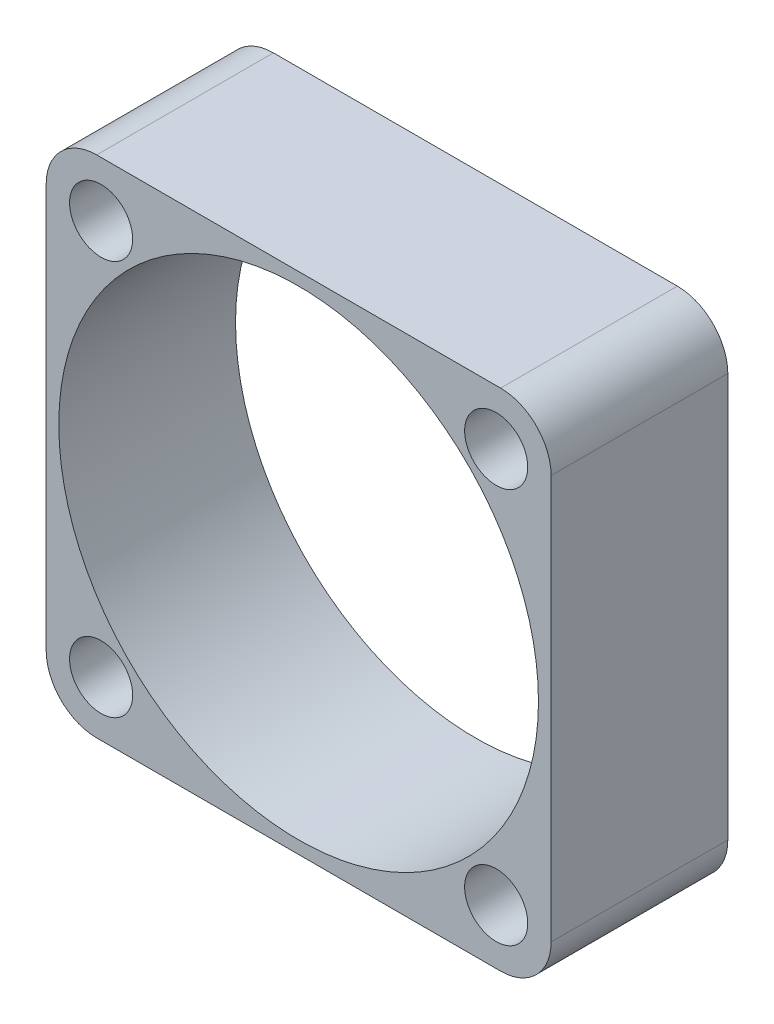
ISO-10303-21;
HEADER;
FILE_DESCRIPTION(('STEP AP214'),'2;1');
FILE_NAME('part.step','',(''),(''),'','','');
FILE_SCHEMA(('AUTOMOTIVE_DESIGN { 1 0 10303 214 1 1 1 1 }'));
ENDSEC;
DATA;
#1=APPLICATION_CONTEXT('core data for automotive mechanical design processes');
#2=APPLICATION_PROTOCOL_DEFINITION('international standard','automotive_design',2000,#1);
#3=PRODUCT_CONTEXT('',#1,'mechanical');
#4=PRODUCT('Part','Part','',(#3));
#5=PRODUCT_RELATED_PRODUCT_CATEGORY('part','',(#4));
#6=PRODUCT_DEFINITION_FORMATION('','',#4);
#7=PRODUCT_DEFINITION_CONTEXT('part definition',#1,'design');
#8=PRODUCT_DEFINITION('design','',#6,#7);
#9=PRODUCT_DEFINITION_SHAPE('','',#8);
#10=(LENGTH_UNIT() NAMED_UNIT(*) SI_UNIT(.MILLI.,.METRE.));
#11=(NAMED_UNIT(*) PLANE_ANGLE_UNIT() SI_UNIT($,.RADIAN.));
#12=(NAMED_UNIT(*) SI_UNIT($,.STERADIAN.) SOLID_ANGLE_UNIT());
#13=UNCERTAINTY_MEASURE_WITH_UNIT(LENGTH_MEASURE(1.E-05),#10,'distance_accuracy_value','');
#14=(GEOMETRIC_REPRESENTATION_CONTEXT(3) GLOBAL_UNCERTAINTY_ASSIGNED_CONTEXT((#13)) GLOBAL_UNIT_ASSIGNED_CONTEXT((#10,
#11,#12)) REPRESENTATION_CONTEXT('',''));
#15=CARTESIAN_POINT('',(0.,0.,0.));
#16=DIRECTION('',(0.,0.,1.));
#17=DIRECTION('',(1.,0.,0.));
#18=AXIS2_PLACEMENT_3D('',#15,#16,#17);
#19=CARTESIAN_POINT('',(0.,0.,7.));
#20=DIRECTION('',(0.,0.,-1.));
#21=DIRECTION('',(-1.,0.,0.));
#22=AXIS2_PLACEMENT_3D('',#19,#20,#21);
#23=PLANE('',#22);
#24=CARTESIAN_POINT('',(-7.825,-7.825,7.));
#25=DIRECTION('',(0.,0.,1.));
#26=DIRECTION('',(1.,0.,0.));
#27=AXIS2_PLACEMENT_3D('',#24,#25,#26);
#28=CIRCLE('',#27,1.25);
#29=CARTESIAN_POINT('',(-6.575,-7.825,7.));
#30=VERTEX_POINT('',#29);
#31=EDGE_CURVE('E213',#30,#30,#28,.T.);
#32=ORIENTED_EDGE('',*,*,#31,.F.);
#33=EDGE_LOOP('',(#32));
#34=FACE_BOUND('',#33,.T.);
#35=CARTESIAN_POINT('',(7.825,-7.825,7.));
#36=DIRECTION('',(0.,0.,1.));
#37=DIRECTION('',(1.,0.,0.));
#38=AXIS2_PLACEMENT_3D('',#35,#36,#37);
#39=CIRCLE('',#38,1.25);
#40=CARTESIAN_POINT('',(9.075,-7.825,7.));
#41=VERTEX_POINT('',#40);
#42=EDGE_CURVE('E207',#41,#41,#39,.T.);
#43=ORIENTED_EDGE('',*,*,#42,.F.);
#44=EDGE_LOOP('',(#43));
#45=FACE_BOUND('',#44,.T.);
#46=CARTESIAN_POINT('',(7.825,7.825,7.));
#47=DIRECTION('',(0.,0.,1.));
#48=DIRECTION('',(1.,0.,0.));
#49=AXIS2_PLACEMENT_3D('',#46,#47,#48);
#50=CIRCLE('',#49,1.25);
#51=CARTESIAN_POINT('',(9.075,7.825,7.));
#52=VERTEX_POINT('',#51);
#53=EDGE_CURVE('E201',#52,#52,#50,.T.);
#54=ORIENTED_EDGE('',*,*,#53,.F.);
#55=EDGE_LOOP('',(#54));
#56=FACE_BOUND('',#55,.T.);
#57=CARTESIAN_POINT('',(-7.825,7.825,7.));
#58=DIRECTION('',(0.,0.,1.));
#59=DIRECTION('',(1.,0.,0.));
#60=AXIS2_PLACEMENT_3D('',#57,#58,#59);
#61=CIRCLE('',#60,1.25);
#62=CARTESIAN_POINT('',(-6.575,7.825,7.));
#63=VERTEX_POINT('',#62);
#64=EDGE_CURVE('E195',#63,#63,#61,.T.);
#65=ORIENTED_EDGE('',*,*,#64,.F.);
#66=EDGE_LOOP('',(#65));
#67=FACE_BOUND('',#66,.T.);
#68=DIRECTION('',(-1.,0.,0.));
#69=VECTOR('',#68,1.);
#70=CARTESIAN_POINT('',(-10.,10.,7.));
#71=LINE('',#70,#69);
#72=CARTESIAN_POINT('',(8.,10.,7.));
#73=VERTEX_POINT('',#72);
#74=CARTESIAN_POINT('',(-8.,10.,7.));
#75=VERTEX_POINT('',#74);
#76=EDGE_CURVE('E179',#73,#75,#71,.T.);
#77=ORIENTED_EDGE('',*,*,#76,.T.);
#78=CARTESIAN_POINT('',(-8.,8.,7.));
#79=DIRECTION('',(0.,0.,-1.));
#80=DIRECTION('',(-1.,0.,0.));
#81=AXIS2_PLACEMENT_3D('',#78,#79,#80);
#82=CIRCLE('',#81,2.);
#83=CARTESIAN_POINT('',(-10.,8.,7.));
#84=VERTEX_POINT('',#83);
#85=EDGE_CURVE('E160',#75,#84,#82,.F.);
#86=ORIENTED_EDGE('',*,*,#85,.T.);
#87=DIRECTION('',(0.,-1.,0.));
#88=VECTOR('',#87,1.);
#89=CARTESIAN_POINT('',(-10.,-10.,7.));
#90=LINE('',#89,#88);
#91=CARTESIAN_POINT('',(-10.,-8.,7.));
#92=VERTEX_POINT('',#91);
#93=EDGE_CURVE('E130',#84,#92,#90,.T.);
#94=ORIENTED_EDGE('',*,*,#93,.T.);
#95=CARTESIAN_POINT('',(-8.,-8.,7.));
#96=DIRECTION('',(0.,0.,-1.));
#97=DIRECTION('',(-1.,0.,0.));
#98=AXIS2_PLACEMENT_3D('',#95,#96,#97);
#99=CIRCLE('',#98,2.);
#100=CARTESIAN_POINT('',(-8.,-10.,7.));
#101=VERTEX_POINT('',#100);
#102=EDGE_CURVE('E66',#92,#101,#99,.F.);
#103=ORIENTED_EDGE('',*,*,#102,.T.);
#104=DIRECTION('',(1.,0.,0.));
#105=VECTOR('',#104,1.);
#106=CARTESIAN_POINT('',(-10.,-10.,7.));
#107=LINE('',#106,#105);
#108=CARTESIAN_POINT('',(8.,-10.,7.));
#109=VERTEX_POINT('',#108);
#110=EDGE_CURVE('E146',#101,#109,#107,.T.);
#111=ORIENTED_EDGE('',*,*,#110,.T.);
#112=CARTESIAN_POINT('',(8.,-8.,7.));
#113=DIRECTION('',(0.,0.,-1.));
#114=DIRECTION('',(-1.,0.,0.));
#115=AXIS2_PLACEMENT_3D('',#112,#113,#114);
#116=CIRCLE('',#115,2.);
#117=CARTESIAN_POINT('',(10.,-8.,7.));
#118=VERTEX_POINT('',#117);
#119=EDGE_CURVE('E157',#109,#118,#116,.F.);
#120=ORIENTED_EDGE('',*,*,#119,.T.);
#121=DIRECTION('',(0.,1.,0.));
#122=VECTOR('',#121,1.);
#123=CARTESIAN_POINT('',(10.,-10.,7.));
#124=LINE('',#123,#122);
#125=CARTESIAN_POINT('',(10.,8.,7.));
#126=VERTEX_POINT('',#125);
#127=EDGE_CURVE('E140',#118,#126,#124,.T.);
#128=ORIENTED_EDGE('',*,*,#127,.T.);
#129=CARTESIAN_POINT('',(8.,8.,7.));
#130=DIRECTION('',(0.,0.,-1.));
#131=DIRECTION('',(-1.,0.,0.));
#132=AXIS2_PLACEMENT_3D('',#129,#130,#131);
#133=CIRCLE('',#132,2.);
#134=EDGE_CURVE('E155',#126,#73,#133,.F.);
#135=ORIENTED_EDGE('',*,*,#134,.T.);
#136=EDGE_LOOP('',(#77,#86,#94,#103,#111,#120,#128,#135));
#137=FACE_BOUND('',#136,.T.);
#138=CARTESIAN_POINT('',(0.,0.,7.));
#139=DIRECTION('',(0.,0.,1.));
#140=DIRECTION('',(1.,0.,0.));
#141=AXIS2_PLACEMENT_3D('',#138,#139,#140);
#142=CIRCLE('',#141,9.5);
#143=CARTESIAN_POINT('',(9.5,0.,7.));
#144=VERTEX_POINT('',#143);
#145=EDGE_CURVE('E184',#144,#144,#142,.T.);
#146=ORIENTED_EDGE('',*,*,#145,.F.);
#147=EDGE_LOOP('',(#146));
#148=FACE_BOUND('',#147,.T.);
#149=ADVANCED_FACE('F44',(#34,#45,#56,#67,#137,#148),#23,.F.);
#150=CARTESIAN_POINT('',(0.,0.,0.));
#151=DIRECTION('',(0.,0.,-1.));
#152=DIRECTION('',(-1.,0.,0.));
#153=AXIS2_PLACEMENT_3D('',#150,#151,#152);
#154=PLANE('',#153);
#155=CARTESIAN_POINT('',(-7.825,-7.825,0.));
#156=DIRECTION('',(0.,0.,1.));
#157=DIRECTION('',(1.,0.,0.));
#158=AXIS2_PLACEMENT_3D('',#155,#156,#157);
#159=CIRCLE('',#158,1.25);
#160=CARTESIAN_POINT('',(-6.575,-7.825,0.));
#161=VERTEX_POINT('',#160);
#162=EDGE_CURVE('E210',#161,#161,#159,.T.);
#163=ORIENTED_EDGE('',*,*,#162,.T.);
#164=EDGE_LOOP('',(#163));
#165=FACE_BOUND('',#164,.T.);
#166=CARTESIAN_POINT('',(7.825,-7.825,0.));
#167=DIRECTION('',(0.,0.,1.));
#168=DIRECTION('',(1.,0.,0.));
#169=AXIS2_PLACEMENT_3D('',#166,#167,#168);
#170=CIRCLE('',#169,1.25);
#171=CARTESIAN_POINT('',(9.075,-7.825,0.));
#172=VERTEX_POINT('',#171);
#173=EDGE_CURVE('E204',#172,#172,#170,.T.);
#174=ORIENTED_EDGE('',*,*,#173,.T.);
#175=EDGE_LOOP('',(#174));
#176=FACE_BOUND('',#175,.T.);
#177=CARTESIAN_POINT('',(7.825,7.825,0.));
#178=DIRECTION('',(0.,0.,1.));
#179=DIRECTION('',(1.,0.,0.));
#180=AXIS2_PLACEMENT_3D('',#177,#178,#179);
#181=CIRCLE('',#180,1.25);
#182=CARTESIAN_POINT('',(9.075,7.825,0.));
#183=VERTEX_POINT('',#182);
#184=EDGE_CURVE('E198',#183,#183,#181,.T.);
#185=ORIENTED_EDGE('',*,*,#184,.T.);
#186=EDGE_LOOP('',(#185));
#187=FACE_BOUND('',#186,.T.);
#188=CARTESIAN_POINT('',(-7.825,7.825,0.));
#189=DIRECTION('',(0.,0.,1.));
#190=DIRECTION('',(1.,0.,0.));
#191=AXIS2_PLACEMENT_3D('',#188,#189,#190);
#192=CIRCLE('',#191,1.25);
#193=CARTESIAN_POINT('',(-6.575,7.825,0.));
#194=VERTEX_POINT('',#193);
#195=EDGE_CURVE('E193',#194,#194,#192,.T.);
#196=ORIENTED_EDGE('',*,*,#195,.T.);
#197=EDGE_LOOP('',(#196));
#198=FACE_BOUND('',#197,.T.);
#199=DIRECTION('',(0.,-1.,0.));
#200=VECTOR('',#199,1.);
#201=CARTESIAN_POINT('',(-10.,-10.,0.));
#202=LINE('',#201,#200);
#203=CARTESIAN_POINT('',(-10.,8.,0.));
#204=VERTEX_POINT('',#203);
#205=CARTESIAN_POINT('',(-10.,-8.,0.));
#206=VERTEX_POINT('',#205);
#207=EDGE_CURVE('E128',#204,#206,#202,.T.);
#208=ORIENTED_EDGE('',*,*,#207,.F.);
#209=CARTESIAN_POINT('',(-8.,8.,0.));
#210=DIRECTION('',(0.,0.,-1.));
#211=DIRECTION('',(-1.,0.,0.));
#212=AXIS2_PLACEMENT_3D('',#209,#210,#211);
#213=CIRCLE('',#212,2.);
#214=CARTESIAN_POINT('',(-8.,10.,0.));
#215=VERTEX_POINT('',#214);
#216=EDGE_CURVE('E111',#204,#215,#213,.T.);
#217=ORIENTED_EDGE('',*,*,#216,.T.);
#218=DIRECTION('',(-1.,0.,0.));
#219=VECTOR('',#218,1.);
#220=CARTESIAN_POINT('',(-10.,10.,0.));
#221=LINE('',#220,#219);
#222=CARTESIAN_POINT('',(8.,10.,0.));
#223=VERTEX_POINT('',#222);
#224=EDGE_CURVE('E138',#223,#215,#221,.T.);
#225=ORIENTED_EDGE('',*,*,#224,.F.);
#226=CARTESIAN_POINT('',(8.,8.,0.));
#227=DIRECTION('',(0.,0.,-1.));
#228=DIRECTION('',(-1.,0.,0.));
#229=AXIS2_PLACEMENT_3D('',#226,#227,#228);
#230=CIRCLE('',#229,2.);
#231=CARTESIAN_POINT('',(10.,8.,0.));
#232=VERTEX_POINT('',#231);
#233=EDGE_CURVE('E131',#223,#232,#230,.T.);
#234=ORIENTED_EDGE('',*,*,#233,.T.);
#235=DIRECTION('',(0.,1.,0.));
#236=VECTOR('',#235,1.);
#237=CARTESIAN_POINT('',(10.,-10.,0.));
#238=LINE('',#237,#236);
#239=CARTESIAN_POINT('',(10.,-8.,0.));
#240=VERTEX_POINT('',#239);
#241=EDGE_CURVE('E142',#240,#232,#238,.T.);
#242=ORIENTED_EDGE('',*,*,#241,.F.);
#243=CARTESIAN_POINT('',(8.,-8.,0.));
#244=DIRECTION('',(0.,0.,-1.));
#245=DIRECTION('',(-1.,0.,0.));
#246=AXIS2_PLACEMENT_3D('',#243,#244,#245);
#247=CIRCLE('',#246,2.);
#248=CARTESIAN_POINT('',(8.,-10.,0.));
#249=VERTEX_POINT('',#248);
#250=EDGE_CURVE('E149',#240,#249,#247,.T.);
#251=ORIENTED_EDGE('',*,*,#250,.T.);
#252=DIRECTION('',(1.,0.,0.));
#253=VECTOR('',#252,1.);
#254=CARTESIAN_POINT('',(-10.,-10.,0.));
#255=LINE('',#254,#253);
#256=CARTESIAN_POINT('',(-8.,-10.,0.));
#257=VERTEX_POINT('',#256);
#258=EDGE_CURVE('E137',#257,#249,#255,.T.);
#259=ORIENTED_EDGE('',*,*,#258,.F.);
#260=CARTESIAN_POINT('',(-8.,-8.,0.));
#261=DIRECTION('',(0.,0.,-1.));
#262=DIRECTION('',(-1.,0.,0.));
#263=AXIS2_PLACEMENT_3D('',#260,#261,#262);
#264=CIRCLE('',#263,2.);
#265=EDGE_CURVE('E122',#257,#206,#264,.T.);
#266=ORIENTED_EDGE('',*,*,#265,.T.);
#267=EDGE_LOOP('',(#208,#217,#225,#234,#242,#251,#259,#266));
#268=FACE_BOUND('',#267,.T.);
#269=CARTESIAN_POINT('',(0.,0.,0.));
#270=DIRECTION('',(0.,0.,1.));
#271=DIRECTION('',(1.,0.,0.));
#272=AXIS2_PLACEMENT_3D('',#269,#270,#271);
#273=CIRCLE('',#272,9.5);
#274=CARTESIAN_POINT('',(9.5,0.,0.));
#275=VERTEX_POINT('',#274);
#276=EDGE_CURVE('E186',#275,#275,#273,.T.);
#277=ORIENTED_EDGE('',*,*,#276,.T.);
#278=EDGE_LOOP('',(#277));
#279=FACE_BOUND('',#278,.T.);
#280=ADVANCED_FACE('F134',(#165,#176,#187,#198,#268,#279),#154,.T.);
#281=CARTESIAN_POINT('',(10.,-10.,7.));
#282=DIRECTION('',(-1.,0.,0.));
#283=DIRECTION('',(0.,0.,1.));
#284=AXIS2_PLACEMENT_3D('',#281,#282,#283);
#285=PLANE('',#284);
#286=ORIENTED_EDGE('',*,*,#127,.F.);
#287=DIRECTION('',(0.,0.,-1.));
#288=VECTOR('',#287,1.);
#289=CARTESIAN_POINT('',(10.,-8.,7.));
#290=LINE('',#289,#288);
#291=EDGE_CURVE('E13',#118,#240,#290,.T.);
#292=ORIENTED_EDGE('',*,*,#291,.T.);
#293=ORIENTED_EDGE('',*,*,#241,.T.);
#294=DIRECTION('',(0.,0.,-1.));
#295=VECTOR('',#294,1.);
#296=CARTESIAN_POINT('',(10.,8.,7.));
#297=LINE('',#296,#295);
#298=EDGE_CURVE('E52',#232,#126,#297,.F.);
#299=ORIENTED_EDGE('',*,*,#298,.T.);
#300=EDGE_LOOP('',(#286,#292,#293,#299));
#301=FACE_BOUND('',#300,.T.);
#302=ADVANCED_FACE('F170',(#301),#285,.F.);
#303=CARTESIAN_POINT('',(-10.,10.,7.));
#304=DIRECTION('',(0.,-1.,0.));
#305=DIRECTION('',(0.,0.,-1.));
#306=AXIS2_PLACEMENT_3D('',#303,#304,#305);
#307=PLANE('',#306);
#308=ORIENTED_EDGE('',*,*,#224,.T.);
#309=DIRECTION('',(0.,0.,-1.));
#310=VECTOR('',#309,1.);
#311=CARTESIAN_POINT('',(-8.,10.,7.));
#312=LINE('',#311,#310);
#313=EDGE_CURVE('E116',#215,#75,#312,.F.);
#314=ORIENTED_EDGE('',*,*,#313,.T.);
#315=ORIENTED_EDGE('',*,*,#76,.F.);
#316=DIRECTION('',(0.,0.,-1.));
#317=VECTOR('',#316,1.);
#318=CARTESIAN_POINT('',(8.,10.,7.));
#319=LINE('',#318,#317);
#320=EDGE_CURVE('E121',#73,#223,#319,.T.);
#321=ORIENTED_EDGE('',*,*,#320,.T.);
#322=EDGE_LOOP('',(#308,#314,#315,#321));
#323=FACE_BOUND('',#322,.T.);
#324=ADVANCED_FACE('F183',(#323),#307,.F.);
#325=CARTESIAN_POINT('',(-10.,-10.,7.));
#326=DIRECTION('',(1.,0.,0.));
#327=DIRECTION('',(0.,0.,-1.));
#328=AXIS2_PLACEMENT_3D('',#325,#326,#327);
#329=PLANE('',#328);
#330=ORIENTED_EDGE('',*,*,#93,.F.);
#331=DIRECTION('',(0.,0.,-1.));
#332=VECTOR('',#331,1.);
#333=CARTESIAN_POINT('',(-10.,8.,7.));
#334=LINE('',#333,#332);
#335=EDGE_CURVE('E115',#84,#204,#334,.T.);
#336=ORIENTED_EDGE('',*,*,#335,.T.);
#337=ORIENTED_EDGE('',*,*,#207,.T.);
#338=DIRECTION('',(0.,0.,-1.));
#339=VECTOR('',#338,1.);
#340=CARTESIAN_POINT('',(-10.,-8.,7.));
#341=LINE('',#340,#339);
#342=EDGE_CURVE('E132',#206,#92,#341,.F.);
#343=ORIENTED_EDGE('',*,*,#342,.T.);
#344=EDGE_LOOP('',(#330,#336,#337,#343));
#345=FACE_BOUND('',#344,.T.);
#346=ADVANCED_FACE('F127',(#345),#329,.F.);
#347=CARTESIAN_POINT('',(-10.,-10.,7.));
#348=DIRECTION('',(0.,1.,0.));
#349=DIRECTION('',(0.,0.,1.));
#350=AXIS2_PLACEMENT_3D('',#347,#348,#349);
#351=PLANE('',#350);
#352=ORIENTED_EDGE('',*,*,#110,.F.);
#353=DIRECTION('',(0.,0.,-1.));
#354=VECTOR('',#353,1.);
#355=CARTESIAN_POINT('',(-8.,-10.,7.));
#356=LINE('',#355,#354);
#357=EDGE_CURVE('E163',#101,#257,#356,.T.);
#358=ORIENTED_EDGE('',*,*,#357,.T.);
#359=ORIENTED_EDGE('',*,*,#258,.T.);
#360=DIRECTION('',(0.,0.,-1.));
#361=VECTOR('',#360,1.);
#362=CARTESIAN_POINT('',(8.,-10.,7.));
#363=LINE('',#362,#361);
#364=EDGE_CURVE('E59',#249,#109,#363,.F.);
#365=ORIENTED_EDGE('',*,*,#364,.T.);
#366=EDGE_LOOP('',(#352,#358,#359,#365));
#367=FACE_BOUND('',#366,.T.);
#368=ADVANCED_FACE('F254',(#367),#351,.F.);
#369=CARTESIAN_POINT('',(0.,0.,7.));
#370=DIRECTION('',(0.,0.,-1.));
#371=DIRECTION('',(-1.,0.,0.));
#372=AXIS2_PLACEMENT_3D('',#369,#370,#371);
#373=CYLINDRICAL_SURFACE('',#372,9.5);
#374=ORIENTED_EDGE('',*,*,#145,.T.);
#375=EDGE_LOOP('',(#374));
#376=FACE_BOUND('',#375,.T.);
#377=ORIENTED_EDGE('',*,*,#276,.F.);
#378=EDGE_LOOP('',(#377));
#379=FACE_BOUND('',#378,.T.);
#380=ADVANCED_FACE('F252',(#376,#379),#373,.F.);
#381=CARTESIAN_POINT('',(-8.,8.,7.));
#382=DIRECTION('',(0.,0.,-1.));
#383=DIRECTION('',(-1.,0.,0.));
#384=AXIS2_PLACEMENT_3D('',#381,#382,#383);
#385=CYLINDRICAL_SURFACE('',#384,2.);
#386=ORIENTED_EDGE('',*,*,#85,.F.);
#387=ORIENTED_EDGE('',*,*,#313,.F.);
#388=ORIENTED_EDGE('',*,*,#216,.F.);
#389=ORIENTED_EDGE('',*,*,#335,.F.);
#390=EDGE_LOOP('',(#386,#387,#388,#389));
#391=FACE_BOUND('',#390,.T.);
#392=ADVANCED_FACE('F114',(#391),#385,.T.);
#393=CARTESIAN_POINT('',(-8.,-8.,7.));
#394=DIRECTION('',(0.,0.,-1.));
#395=DIRECTION('',(-1.,0.,0.));
#396=AXIS2_PLACEMENT_3D('',#393,#394,#395);
#397=CYLINDRICAL_SURFACE('',#396,2.);
#398=ORIENTED_EDGE('',*,*,#102,.F.);
#399=ORIENTED_EDGE('',*,*,#342,.F.);
#400=ORIENTED_EDGE('',*,*,#265,.F.);
#401=ORIENTED_EDGE('',*,*,#357,.F.);
#402=EDGE_LOOP('',(#398,#399,#400,#401));
#403=FACE_BOUND('',#402,.T.);
#404=ADVANCED_FACE('F269',(#403),#397,.T.);
#405=CARTESIAN_POINT('',(8.,-8.,7.));
#406=DIRECTION('',(0.,0.,-1.));
#407=DIRECTION('',(-1.,0.,0.));
#408=AXIS2_PLACEMENT_3D('',#405,#406,#407);
#409=CYLINDRICAL_SURFACE('',#408,2.);
#410=ORIENTED_EDGE('',*,*,#119,.F.);
#411=ORIENTED_EDGE('',*,*,#364,.F.);
#412=ORIENTED_EDGE('',*,*,#250,.F.);
#413=ORIENTED_EDGE('',*,*,#291,.F.);
#414=EDGE_LOOP('',(#410,#411,#412,#413));
#415=FACE_BOUND('',#414,.T.);
#416=ADVANCED_FACE('F248',(#415),#409,.T.);
#417=CARTESIAN_POINT('',(8.,8.,7.));
#418=DIRECTION('',(0.,0.,-1.));
#419=DIRECTION('',(-1.,0.,0.));
#420=AXIS2_PLACEMENT_3D('',#417,#418,#419);
#421=CYLINDRICAL_SURFACE('',#420,2.);
#422=ORIENTED_EDGE('',*,*,#134,.F.);
#423=ORIENTED_EDGE('',*,*,#298,.F.);
#424=ORIENTED_EDGE('',*,*,#233,.F.);
#425=ORIENTED_EDGE('',*,*,#320,.F.);
#426=EDGE_LOOP('',(#422,#423,#424,#425));
#427=FACE_BOUND('',#426,.T.);
#428=ADVANCED_FACE('F46',(#427),#421,.T.);
#429=CARTESIAN_POINT('',(-7.825,7.825,0.));
#430=DIRECTION('',(0.,0.,1.));
#431=DIRECTION('',(1.,0.,0.));
#432=AXIS2_PLACEMENT_3D('',#429,#430,#431);
#433=CYLINDRICAL_SURFACE('',#432,1.25);
#434=ORIENTED_EDGE('',*,*,#195,.F.);
#435=EDGE_LOOP('',(#434));
#436=FACE_BOUND('',#435,.T.);
#437=ORIENTED_EDGE('',*,*,#64,.T.);
#438=EDGE_LOOP('',(#437));
#439=FACE_BOUND('',#438,.T.);
#440=ADVANCED_FACE('F237',(#436,#439),#433,.F.);
#441=CARTESIAN_POINT('',(7.825,7.825,0.));
#442=DIRECTION('',(0.,0.,1.));
#443=DIRECTION('',(1.,0.,0.));
#444=AXIS2_PLACEMENT_3D('',#441,#442,#443);
#445=CYLINDRICAL_SURFACE('',#444,1.25);
#446=ORIENTED_EDGE('',*,*,#184,.F.);
#447=EDGE_LOOP('',(#446));
#448=FACE_BOUND('',#447,.T.);
#449=ORIENTED_EDGE('',*,*,#53,.T.);
#450=EDGE_LOOP('',(#449));
#451=FACE_BOUND('',#450,.T.);
#452=ADVANCED_FACE('F239',(#448,#451),#445,.F.);
#453=CARTESIAN_POINT('',(7.825,-7.825,0.));
#454=DIRECTION('',(0.,0.,1.));
#455=DIRECTION('',(1.,0.,0.));
#456=AXIS2_PLACEMENT_3D('',#453,#454,#455);
#457=CYLINDRICAL_SURFACE('',#456,1.25);
#458=ORIENTED_EDGE('',*,*,#173,.F.);
#459=EDGE_LOOP('',(#458));
#460=FACE_BOUND('',#459,.T.);
#461=ORIENTED_EDGE('',*,*,#42,.T.);
#462=EDGE_LOOP('',(#461));
#463=FACE_BOUND('',#462,.T.);
#464=ADVANCED_FACE('F224',(#460,#463),#457,.F.);
#465=CARTESIAN_POINT('',(-7.825,-7.825,0.));
#466=DIRECTION('',(0.,0.,1.));
#467=DIRECTION('',(1.,0.,0.));
#468=AXIS2_PLACEMENT_3D('',#465,#466,#467);
#469=CYLINDRICAL_SURFACE('',#468,1.25);
#470=ORIENTED_EDGE('',*,*,#162,.F.);
#471=EDGE_LOOP('',(#470));
#472=FACE_BOUND('',#471,.T.);
#473=ORIENTED_EDGE('',*,*,#31,.T.);
#474=EDGE_LOOP('',(#473));
#475=FACE_BOUND('',#474,.T.);
#476=ADVANCED_FACE('F221',(#472,#475),#469,.F.);
#477=CLOSED_SHELL('',(#149,#280,#302,#324,#346,#368,#380,#392,#404,#416,#428,#440,#452,#464,#476));
#478=MANIFOLD_SOLID_BREP('B2',#477);
#479=ADVANCED_BREP_SHAPE_REPRESENTATION('',(#18,#478),#14);
#480=SHAPE_DEFINITION_REPRESENTATION(#9,#479);
ENDSEC;
END-ISO-10303-21;
